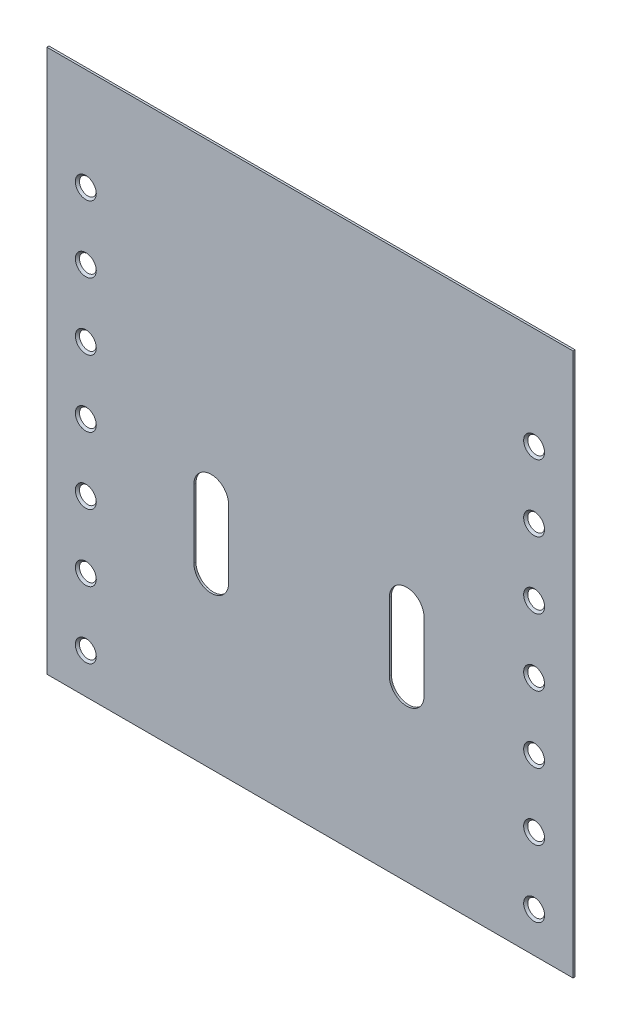
ISO-10303-21;
HEADER;
FILE_DESCRIPTION(('STEP AP214'),'2;1');
FILE_NAME('part.step','',(''),(''),'','','');
FILE_SCHEMA(('AUTOMOTIVE_DESIGN { 1 0 10303 214 1 1 1 1 }'));
ENDSEC;
DATA;
#1=APPLICATION_CONTEXT('core data for automotive mechanical design processes');
#2=APPLICATION_PROTOCOL_DEFINITION('international standard','automotive_design',2000,#1);
#3=PRODUCT_CONTEXT('',#1,'mechanical');
#4=PRODUCT('Part','Part','',(#3));
#5=PRODUCT_RELATED_PRODUCT_CATEGORY('part','',(#4));
#6=PRODUCT_DEFINITION_FORMATION('','',#4);
#7=PRODUCT_DEFINITION_CONTEXT('part definition',#1,'design');
#8=PRODUCT_DEFINITION('design','',#6,#7);
#9=PRODUCT_DEFINITION_SHAPE('','',#8);
#10=(LENGTH_UNIT() NAMED_UNIT(*) SI_UNIT(.MILLI.,.METRE.));
#11=(NAMED_UNIT(*) PLANE_ANGLE_UNIT() SI_UNIT($,.RADIAN.));
#12=(NAMED_UNIT(*) SI_UNIT($,.STERADIAN.) SOLID_ANGLE_UNIT());
#13=UNCERTAINTY_MEASURE_WITH_UNIT(LENGTH_MEASURE(1.E-05),#10,'distance_accuracy_value','');
#14=(GEOMETRIC_REPRESENTATION_CONTEXT(3) GLOBAL_UNCERTAINTY_ASSIGNED_CONTEXT((#13)) GLOBAL_UNIT_ASSIGNED_CONTEXT((#10,
#11,#12)) REPRESENTATION_CONTEXT('',''));
#15=CARTESIAN_POINT('',(0.,0.,0.));
#16=DIRECTION('',(0.,0.,1.));
#17=DIRECTION('',(1.,0.,0.));
#18=AXIS2_PLACEMENT_3D('',#15,#16,#17);
#19=CARTESIAN_POINT('',(0.,0.,-0.7747));
#20=DIRECTION('',(0.,0.,-1.));
#21=DIRECTION('',(-1.,0.,0.));
#22=AXIS2_PLACEMENT_3D('',#19,#20,#21);
#23=PLANE('',#22);
#24=CARTESIAN_POINT('',(-20.9049999994247,-222.000000003201,-0.7747));
#25=DIRECTION('',(0.,0.,-1.));
#26=DIRECTION('',(-1.,0.,0.));
#27=AXIS2_PLACEMENT_3D('',#24,#25,#26);
#28=CIRCLE('',#27,3.13730000000001);
#29=CARTESIAN_POINT('',(-24.0422999994247,-222.000000003201,-0.7747));
#30=VERTEX_POINT('',#29);
#31=EDGE_CURVE('E45',#30,#30,#28,.T.);
#32=ORIENTED_EDGE('',*,*,#31,.F.);
#33=EDGE_LOOP('',(#32));
#34=FACE_BOUND('',#33,.T.);
#35=CARTESIAN_POINT('',(-20.9049999955843,-122.00000000322,-0.7747));
#36=DIRECTION('',(0.,0.,-1.));
#37=DIRECTION('',(-1.,0.,0.));
#38=AXIS2_PLACEMENT_3D('',#35,#36,#37);
#39=CIRCLE('',#38,3.13730000000001);
#40=CARTESIAN_POINT('',(-24.0422999955843,-122.00000000322,-0.7747));
#41=VERTEX_POINT('',#40);
#42=EDGE_CURVE('E182',#41,#41,#39,.T.);
#43=ORIENTED_EDGE('',*,*,#42,.F.);
#44=EDGE_LOOP('',(#43));
#45=FACE_BOUND('',#44,.T.);
#46=CARTESIAN_POINT('',(-188.644999999999,-221.99999999998,-0.7747));
#47=DIRECTION('',(0.,0.,-1.));
#48=DIRECTION('',(-1.,0.,0.));
#49=AXIS2_PLACEMENT_3D('',#46,#47,#48);
#50=CIRCLE('',#49,3.1373);
#51=CARTESIAN_POINT('',(-191.782299999999,-221.99999999998,-0.7747));
#52=VERTEX_POINT('',#51);
#53=EDGE_CURVE('E227',#52,#52,#50,.T.);
#54=ORIENTED_EDGE('',*,*,#53,.F.);
#55=EDGE_LOOP('',(#54));
#56=FACE_BOUND('',#55,.T.);
#57=CARTESIAN_POINT('',(-188.645,-197.,-0.7747));
#58=DIRECTION('',(0.,0.,-1.));
#59=DIRECTION('',(-1.,0.,0.));
#60=AXIS2_PLACEMENT_3D('',#57,#58,#59);
#61=CIRCLE('',#60,3.1373);
#62=CARTESIAN_POINT('',(-191.7823,-197.,-0.7747));
#63=VERTEX_POINT('',#62);
#64=EDGE_CURVE('E233',#63,#63,#61,.T.);
#65=ORIENTED_EDGE('',*,*,#64,.F.);
#66=EDGE_LOOP('',(#65));
#67=FACE_BOUND('',#66,.T.);
#68=CARTESIAN_POINT('',(-188.645,-172.,-0.7747));
#69=DIRECTION('',(0.,0.,-1.));
#70=DIRECTION('',(-1.,0.,0.));
#71=AXIS2_PLACEMENT_3D('',#68,#69,#70);
#72=CIRCLE('',#71,3.1373);
#73=CARTESIAN_POINT('',(-191.7823,-172.,-0.7747));
#74=VERTEX_POINT('',#73);
#75=EDGE_CURVE('E239',#74,#74,#72,.T.);
#76=ORIENTED_EDGE('',*,*,#75,.F.);
#77=EDGE_LOOP('',(#76));
#78=FACE_BOUND('',#77,.T.);
#79=CARTESIAN_POINT('',(-188.645,-122.,-0.7747));
#80=DIRECTION('',(0.,0.,-1.));
#81=DIRECTION('',(-1.,0.,0.));
#82=AXIS2_PLACEMENT_3D('',#79,#80,#81);
#83=CIRCLE('',#82,3.1373);
#84=CARTESIAN_POINT('',(-191.7823,-122.,-0.7747));
#85=VERTEX_POINT('',#84);
#86=EDGE_CURVE('E251',#85,#85,#83,.T.);
#87=ORIENTED_EDGE('',*,*,#86,.F.);
#88=EDGE_LOOP('',(#87));
#89=FACE_BOUND('',#88,.T.);
#90=CARTESIAN_POINT('',(-188.644999999999,-71.9999999999807,-0.7747));
#91=DIRECTION('',(0.,0.,-1.));
#92=DIRECTION('',(-1.,0.,0.));
#93=AXIS2_PLACEMENT_3D('',#90,#91,#92);
#94=CIRCLE('',#93,3.1373);
#95=CARTESIAN_POINT('',(-191.782299999999,-71.9999999999807,-0.7747));
#96=VERTEX_POINT('',#95);
#97=EDGE_CURVE('E152',#96,#96,#94,.T.);
#98=ORIENTED_EDGE('',*,*,#97,.F.);
#99=EDGE_LOOP('',(#98));
#100=FACE_BOUND('',#99,.T.);
#101=DIRECTION('',(0.,1.,0.));
#102=VECTOR('',#101,1.);
#103=CARTESIAN_POINT('',(-203.2,-237.,-0.7747));
#104=LINE('',#103,#102);
#105=CARTESIAN_POINT('',(-203.2,-237.,-0.7747));
#106=VERTEX_POINT('',#105);
#107=CARTESIAN_POINT('',(-203.2,-33.7999999999999,-0.7747));
#108=VERTEX_POINT('',#107);
#109=EDGE_CURVE('E159',#106,#108,#104,.T.);
#110=ORIENTED_EDGE('',*,*,#109,.T.);
#111=DIRECTION('',(1.,0.,0.));
#112=VECTOR('',#111,1.);
#113=CARTESIAN_POINT('',(-203.2,-33.7999999999999,-0.7747));
#114=LINE('',#113,#112);
#115=CARTESIAN_POINT('',(-6.35000000000006,-33.8,-0.7747));
#116=VERTEX_POINT('',#115);
#117=EDGE_CURVE('E155',#108,#116,#114,.T.);
#118=ORIENTED_EDGE('',*,*,#117,.T.);
#119=DIRECTION('',(0.,-1.,0.));
#120=VECTOR('',#119,1.);
#121=CARTESIAN_POINT('',(-6.35000000000001,-237.,-0.7747));
#122=LINE('',#121,#120);
#123=CARTESIAN_POINT('',(-6.35000000000001,-237.,-0.7747));
#124=VERTEX_POINT('',#123);
#125=EDGE_CURVE('E158',#116,#124,#122,.T.);
#126=ORIENTED_EDGE('',*,*,#125,.T.);
#127=DIRECTION('',(-1.,0.,0.));
#128=VECTOR('',#127,1.);
#129=CARTESIAN_POINT('',(-203.2,-237.,-0.7747));
#130=LINE('',#129,#128);
#131=EDGE_CURVE('E161',#124,#106,#130,.T.);
#132=ORIENTED_EDGE('',*,*,#131,.T.);
#133=EDGE_LOOP('',(#110,#118,#126,#132));
#134=FACE_BOUND('',#133,.T.);
#135=CARTESIAN_POINT('',(-141.721253235897,-173.5,-0.774699999999979));
#136=DIRECTION('',(0.,0.,-1.));
#137=DIRECTION('',(0.,1.,0.));
#138=AXIS2_PLACEMENT_3D('',#135,#136,#137);
#139=CIRCLE('',#138,6.49999999999995);
#140=CARTESIAN_POINT('',(-135.221253235897,-173.5,-0.774699999999979));
#141=VERTEX_POINT('',#140);
#142=CARTESIAN_POINT('',(-148.221253235897,-173.5,-0.7747));
#143=VERTEX_POINT('',#142);
#144=EDGE_CURVE('E58',#141,#143,#139,.T.);
#145=ORIENTED_EDGE('',*,*,#144,.F.);
#146=DIRECTION('',(0.,-1.,0.));
#147=VECTOR('',#146,1.);
#148=CARTESIAN_POINT('',(-135.221253235897,-173.5,-0.774699999999979));
#149=LINE('',#148,#147);
#150=CARTESIAN_POINT('',(-135.221253235897,-148.,-0.774699999999982));
#151=VERTEX_POINT('',#150);
#152=EDGE_CURVE('E263',#151,#141,#149,.T.);
#153=ORIENTED_EDGE('',*,*,#152,.F.);
#154=CARTESIAN_POINT('',(-141.721253235897,-148.,-0.774699999999982));
#155=DIRECTION('',(0.,0.,-1.));
#156=DIRECTION('',(0.,1.,0.));
#157=AXIS2_PLACEMENT_3D('',#154,#155,#156);
#158=CIRCLE('',#157,6.49999999999995);
#159=CARTESIAN_POINT('',(-148.221253235897,-148.,-0.774699999999982));
#160=VERTEX_POINT('',#159);
#161=EDGE_CURVE('E278',#160,#151,#158,.T.);
#162=ORIENTED_EDGE('',*,*,#161,.F.);
#163=DIRECTION('',(0.,1.,0.));
#164=VECTOR('',#163,1.);
#165=CARTESIAN_POINT('',(-148.221253235897,-173.5,-0.774699999999979));
#166=LINE('',#165,#164);
#167=EDGE_CURVE('E274',#143,#160,#166,.T.);
#168=ORIENTED_EDGE('',*,*,#167,.F.);
#169=EDGE_LOOP('',(#145,#153,#162,#168));
#170=FACE_BOUND('',#169,.T.);
#171=CARTESIAN_POINT('',(-68.5692532358968,-173.5,-0.774699999999979));
#172=DIRECTION('',(0.,0.,-1.));
#173=DIRECTION('',(0.,1.,0.));
#174=AXIS2_PLACEMENT_3D('',#171,#172,#173);
#175=CIRCLE('',#174,6.5);
#176=CARTESIAN_POINT('',(-62.0692532358968,-173.5,-0.774699999999979));
#177=VERTEX_POINT('',#176);
#178=CARTESIAN_POINT('',(-75.0692532358968,-173.5,-0.7747));
#179=VERTEX_POINT('',#178);
#180=EDGE_CURVE('E66',#177,#179,#175,.T.);
#181=ORIENTED_EDGE('',*,*,#180,.F.);
#182=DIRECTION('',(0.,-1.,0.));
#183=VECTOR('',#182,1.);
#184=CARTESIAN_POINT('',(-62.0692532358968,-173.5,-0.774699999999979));
#185=LINE('',#184,#183);
#186=CARTESIAN_POINT('',(-62.0692532358968,-148.,-0.774699999999982));
#187=VERTEX_POINT('',#186);
#188=EDGE_CURVE('E293',#187,#177,#185,.T.);
#189=ORIENTED_EDGE('',*,*,#188,.F.);
#190=CARTESIAN_POINT('',(-68.5692532358968,-148.,-0.774699999999982));
#191=DIRECTION('',(0.,0.,-1.));
#192=DIRECTION('',(0.,1.,0.));
#193=AXIS2_PLACEMENT_3D('',#190,#191,#192);
#194=CIRCLE('',#193,6.5);
#195=CARTESIAN_POINT('',(-75.0692532358968,-148.,-0.774699999999982));
#196=VERTEX_POINT('',#195);
#197=EDGE_CURVE('E307',#196,#187,#194,.T.);
#198=ORIENTED_EDGE('',*,*,#197,.F.);
#199=DIRECTION('',(0.,1.,0.));
#200=VECTOR('',#199,1.);
#201=CARTESIAN_POINT('',(-75.0692532358968,-173.5,-0.774699999999979));
#202=LINE('',#201,#200);
#203=EDGE_CURVE('E304',#179,#196,#202,.T.);
#204=ORIENTED_EDGE('',*,*,#203,.F.);
#205=EDGE_LOOP('',(#181,#189,#198,#204));
#206=FACE_BOUND('',#205,.T.);
#207=CARTESIAN_POINT('',(-188.645,-96.9999999999999,-0.7747));
#208=DIRECTION('',(0.,0.,-1.));
#209=DIRECTION('',(-1.,0.,0.));
#210=AXIS2_PLACEMENT_3D('',#207,#208,#209);
#211=CIRCLE('',#210,3.1373);
#212=CARTESIAN_POINT('',(-191.7823,-96.9999999999999,-0.7747));
#213=VERTEX_POINT('',#212);
#214=EDGE_CURVE('E178',#213,#213,#211,.T.);
#215=ORIENTED_EDGE('',*,*,#214,.F.);
#216=EDGE_LOOP('',(#215));
#217=FACE_BOUND('',#216,.T.);
#218=CARTESIAN_POINT('',(-188.645,-147.,-0.7747));
#219=DIRECTION('',(0.,0.,-1.));
#220=DIRECTION('',(-1.,0.,0.));
#221=AXIS2_PLACEMENT_3D('',#218,#219,#220);
#222=CIRCLE('',#221,3.1373);
#223=CARTESIAN_POINT('',(-191.7823,-147.,-0.7747));
#224=VERTEX_POINT('',#223);
#225=EDGE_CURVE('E245',#224,#224,#222,.T.);
#226=ORIENTED_EDGE('',*,*,#225,.F.);
#227=EDGE_LOOP('',(#226));
#228=FACE_BOUND('',#227,.T.);
#229=CARTESIAN_POINT('',(-20.9049999936649,-72.0000000032012,-0.7747));
#230=DIRECTION('',(0.,0.,-1.));
#231=DIRECTION('',(-1.,0.,0.));
#232=AXIS2_PLACEMENT_3D('',#229,#230,#231);
#233=CIRCLE('',#232,3.13730000000001);
#234=CARTESIAN_POINT('',(-24.0422999936649,-72.0000000032012,-0.7747));
#235=VERTEX_POINT('',#234);
#236=EDGE_CURVE('E221',#235,#235,#233,.T.);
#237=ORIENTED_EDGE('',*,*,#236,.F.);
#238=EDGE_LOOP('',(#237));
#239=FACE_BOUND('',#238,.T.);
#240=CARTESIAN_POINT('',(-20.9049999946243,-97.0000000032205,-0.7747));
#241=DIRECTION('',(0.,0.,-1.));
#242=DIRECTION('',(-1.,0.,0.));
#243=AXIS2_PLACEMENT_3D('',#240,#241,#242);
#244=CIRCLE('',#243,3.13730000000001);
#245=CARTESIAN_POINT('',(-24.0422999946243,-97.0000000032205,-0.7747));
#246=VERTEX_POINT('',#245);
#247=EDGE_CURVE('E215',#246,#246,#244,.T.);
#248=ORIENTED_EDGE('',*,*,#247,.F.);
#249=EDGE_LOOP('',(#248));
#250=FACE_BOUND('',#249,.T.);
#251=CARTESIAN_POINT('',(-20.9049999965443,-147.00000000322,-0.7747));
#252=DIRECTION('',(0.,0.,-1.));
#253=DIRECTION('',(-1.,0.,0.));
#254=AXIS2_PLACEMENT_3D('',#251,#252,#253);
#255=CIRCLE('',#254,3.13730000000001);
#256=CARTESIAN_POINT('',(-24.0422999965443,-147.00000000322,-0.7747));
#257=VERTEX_POINT('',#256);
#258=EDGE_CURVE('E187',#257,#257,#255,.T.);
#259=ORIENTED_EDGE('',*,*,#258,.F.);
#260=EDGE_LOOP('',(#259));
#261=FACE_BOUND('',#260,.T.);
#262=CARTESIAN_POINT('',(-20.9049999975043,-172.00000000322,-0.7747));
#263=DIRECTION('',(0.,0.,-1.));
#264=DIRECTION('',(-1.,0.,0.));
#265=AXIS2_PLACEMENT_3D('',#262,#263,#264);
#266=CIRCLE('',#265,3.13730000000001);
#267=CARTESIAN_POINT('',(-24.0422999975043,-172.00000000322,-0.7747));
#268=VERTEX_POINT('',#267);
#269=EDGE_CURVE('E197',#268,#268,#266,.T.);
#270=ORIENTED_EDGE('',*,*,#269,.F.);
#271=EDGE_LOOP('',(#270));
#272=FACE_BOUND('',#271,.T.);
#273=CARTESIAN_POINT('',(-20.9049999984643,-197.00000000322,-0.7747));
#274=DIRECTION('',(0.,0.,-1.));
#275=DIRECTION('',(-1.,0.,0.));
#276=AXIS2_PLACEMENT_3D('',#273,#274,#275);
#277=CIRCLE('',#276,3.13730000000001);
#278=CARTESIAN_POINT('',(-24.0422999984643,-197.00000000322,-0.7747));
#279=VERTEX_POINT('',#278);
#280=EDGE_CURVE('E190',#279,#279,#277,.T.);
#281=ORIENTED_EDGE('',*,*,#280,.F.);
#282=EDGE_LOOP('',(#281));
#283=FACE_BOUND('',#282,.T.);
#284=ADVANCED_FACE('F41',(#34,#45,#56,#67,#78,#89,#100,#134,#170,#206,#217,#228,#239,#250,#261,
#272,#283),#23,.T.);
#285=CARTESIAN_POINT('',(0.,0.,0.));
#286=DIRECTION('',(0.,0.,-1.));
#287=DIRECTION('',(-1.,0.,0.));
#288=AXIS2_PLACEMENT_3D('',#285,#286,#287);
#289=PLANE('',#288);
#290=CARTESIAN_POINT('',(-20.9049999994247,-222.000000003201,0.));
#291=DIRECTION('',(0.,0.,1.));
#292=DIRECTION('',(0.,-1.,0.));
#293=AXIS2_PLACEMENT_3D('',#290,#291,#292);
#294=CIRCLE('',#293,3.912);
#295=CARTESIAN_POINT('',(-20.9049999994247,-225.912000003201,0.));
#296=VERTEX_POINT('',#295);
#297=EDGE_CURVE('E204',#296,#296,#294,.T.);
#298=ORIENTED_EDGE('',*,*,#297,.F.);
#299=EDGE_LOOP('',(#298));
#300=FACE_BOUND('',#299,.T.);
#301=CARTESIAN_POINT('',(-20.9049999965443,-147.00000000322,0.));
#302=DIRECTION('',(0.,0.,1.));
#303=DIRECTION('',(0.,-1.,0.));
#304=AXIS2_PLACEMENT_3D('',#301,#302,#303);
#305=CIRCLE('',#304,3.912);
#306=CARTESIAN_POINT('',(-20.9049999965443,-150.91200000322,0.));
#307=VERTEX_POINT('',#306);
#308=EDGE_CURVE('E189',#307,#307,#305,.T.);
#309=ORIENTED_EDGE('',*,*,#308,.F.);
#310=EDGE_LOOP('',(#309));
#311=FACE_BOUND('',#310,.T.);
#312=CARTESIAN_POINT('',(-188.644999999999,-221.99999999998,0.));
#313=DIRECTION('',(0.,0.,1.));
#314=DIRECTION('',(1.,0.,0.));
#315=AXIS2_PLACEMENT_3D('',#312,#313,#314);
#316=CIRCLE('',#315,3.912);
#317=CARTESIAN_POINT('',(-184.732999999999,-221.99999999998,0.));
#318=VERTEX_POINT('',#317);
#319=EDGE_CURVE('E224',#318,#318,#316,.T.);
#320=ORIENTED_EDGE('',*,*,#319,.F.);
#321=EDGE_LOOP('',(#320));
#322=FACE_BOUND('',#321,.T.);
#323=CARTESIAN_POINT('',(-188.645,-197.,0.));
#324=DIRECTION('',(0.,0.,1.));
#325=DIRECTION('',(1.,0.,0.));
#326=AXIS2_PLACEMENT_3D('',#323,#324,#325);
#327=CIRCLE('',#326,3.912);
#328=CARTESIAN_POINT('',(-184.733,-197.,0.));
#329=VERTEX_POINT('',#328);
#330=EDGE_CURVE('E230',#329,#329,#327,.T.);
#331=ORIENTED_EDGE('',*,*,#330,.F.);
#332=EDGE_LOOP('',(#331));
#333=FACE_BOUND('',#332,.T.);
#334=CARTESIAN_POINT('',(-188.645,-172.,0.));
#335=DIRECTION('',(0.,0.,1.));
#336=DIRECTION('',(1.,0.,0.));
#337=AXIS2_PLACEMENT_3D('',#334,#335,#336);
#338=CIRCLE('',#337,3.912);
#339=CARTESIAN_POINT('',(-184.733,-172.,0.));
#340=VERTEX_POINT('',#339);
#341=EDGE_CURVE('E236',#340,#340,#338,.T.);
#342=ORIENTED_EDGE('',*,*,#341,.F.);
#343=EDGE_LOOP('',(#342));
#344=FACE_BOUND('',#343,.T.);
#345=CARTESIAN_POINT('',(-188.645,-147.,0.));
#346=DIRECTION('',(0.,0.,1.));
#347=DIRECTION('',(1.,0.,0.));
#348=AXIS2_PLACEMENT_3D('',#345,#346,#347);
#349=CIRCLE('',#348,3.912);
#350=CARTESIAN_POINT('',(-184.733,-147.,0.));
#351=VERTEX_POINT('',#350);
#352=EDGE_CURVE('E242',#351,#351,#349,.T.);
#353=ORIENTED_EDGE('',*,*,#352,.F.);
#354=EDGE_LOOP('',(#353));
#355=FACE_BOUND('',#354,.T.);
#356=CARTESIAN_POINT('',(-188.645,-122.,0.));
#357=DIRECTION('',(0.,0.,1.));
#358=DIRECTION('',(1.,0.,0.));
#359=AXIS2_PLACEMENT_3D('',#356,#357,#358);
#360=CIRCLE('',#359,3.912);
#361=CARTESIAN_POINT('',(-184.733,-122.,0.));
#362=VERTEX_POINT('',#361);
#363=EDGE_CURVE('E248',#362,#362,#360,.T.);
#364=ORIENTED_EDGE('',*,*,#363,.F.);
#365=EDGE_LOOP('',(#364));
#366=FACE_BOUND('',#365,.T.);
#367=CARTESIAN_POINT('',(-188.645,-96.9999999999999,0.));
#368=DIRECTION('',(0.,0.,1.));
#369=DIRECTION('',(1.,0.,0.));
#370=AXIS2_PLACEMENT_3D('',#367,#368,#369);
#371=CIRCLE('',#370,3.912);
#372=CARTESIAN_POINT('',(-184.733,-96.9999999999999,0.));
#373=VERTEX_POINT('',#372);
#374=EDGE_CURVE('E181',#373,#373,#371,.T.);
#375=ORIENTED_EDGE('',*,*,#374,.F.);
#376=EDGE_LOOP('',(#375));
#377=FACE_BOUND('',#376,.T.);
#378=CARTESIAN_POINT('',(-188.644999999999,-71.9999999999807,0.));
#379=DIRECTION('',(0.,0.,1.));
#380=DIRECTION('',(1.,0.,0.));
#381=AXIS2_PLACEMENT_3D('',#378,#379,#380);
#382=CIRCLE('',#381,3.912);
#383=CARTESIAN_POINT('',(-184.732999999999,-71.9999999999807,0.));
#384=VERTEX_POINT('',#383);
#385=EDGE_CURVE('E177',#384,#384,#382,.T.);
#386=ORIENTED_EDGE('',*,*,#385,.F.);
#387=EDGE_LOOP('',(#386));
#388=FACE_BOUND('',#387,.T.);
#389=DIRECTION('',(0.,-1.,0.));
#390=VECTOR('',#389,1.);
#391=CARTESIAN_POINT('',(-62.0692532358968,-173.5,0.));
#392=LINE('',#391,#390);
#393=CARTESIAN_POINT('',(-62.0692532358968,-148.,0.));
#394=VERTEX_POINT('',#393);
#395=CARTESIAN_POINT('',(-62.0692532358968,-173.5,0.));
#396=VERTEX_POINT('',#395);
#397=EDGE_CURVE('E299',#394,#396,#392,.T.);
#398=ORIENTED_EDGE('',*,*,#397,.T.);
#399=CARTESIAN_POINT('',(-68.5692532358968,-173.5,0.));
#400=DIRECTION('',(0.,0.,-1.));
#401=DIRECTION('',(0.,1.,0.));
#402=AXIS2_PLACEMENT_3D('',#399,#400,#401);
#403=CIRCLE('',#402,6.5);
#404=CARTESIAN_POINT('',(-75.0692532358968,-173.5,0.));
#405=VERTEX_POINT('',#404);
#406=EDGE_CURVE('E289',#396,#405,#403,.T.);
#407=ORIENTED_EDGE('',*,*,#406,.T.);
#408=DIRECTION('',(0.,1.,0.));
#409=VECTOR('',#408,1.);
#410=CARTESIAN_POINT('',(-75.0692532358968,-173.5,0.));
#411=LINE('',#410,#409);
#412=CARTESIAN_POINT('',(-75.0692532358968,-148.,0.));
#413=VERTEX_POINT('',#412);
#414=EDGE_CURVE('E292',#405,#413,#411,.T.);
#415=ORIENTED_EDGE('',*,*,#414,.T.);
#416=CARTESIAN_POINT('',(-68.5692532358968,-148.,0.));
#417=DIRECTION('',(0.,0.,-1.));
#418=DIRECTION('',(0.,1.,0.));
#419=AXIS2_PLACEMENT_3D('',#416,#417,#418);
#420=CIRCLE('',#419,6.5);
#421=EDGE_CURVE('E296',#413,#394,#420,.T.);
#422=ORIENTED_EDGE('',*,*,#421,.T.);
#423=EDGE_LOOP('',(#398,#407,#415,#422));
#424=FACE_BOUND('',#423,.T.);
#425=DIRECTION('',(0.,-1.,0.));
#426=VECTOR('',#425,1.);
#427=CARTESIAN_POINT('',(-135.221253235897,-173.5,0.));
#428=LINE('',#427,#426);
#429=CARTESIAN_POINT('',(-135.221253235897,-148.,0.));
#430=VERTEX_POINT('',#429);
#431=CARTESIAN_POINT('',(-135.221253235897,-173.5,0.));
#432=VERTEX_POINT('',#431);
#433=EDGE_CURVE('E269',#430,#432,#428,.T.);
#434=ORIENTED_EDGE('',*,*,#433,.T.);
#435=CARTESIAN_POINT('',(-141.721253235897,-173.5,0.));
#436=DIRECTION('',(0.,0.,-1.));
#437=DIRECTION('',(0.,1.,0.));
#438=AXIS2_PLACEMENT_3D('',#435,#436,#437);
#439=CIRCLE('',#438,6.49999999999995);
#440=CARTESIAN_POINT('',(-148.221253235897,-173.5,0.));
#441=VERTEX_POINT('',#440);
#442=EDGE_CURVE('E259',#432,#441,#439,.T.);
#443=ORIENTED_EDGE('',*,*,#442,.T.);
#444=DIRECTION('',(0.,1.,0.));
#445=VECTOR('',#444,1.);
#446=CARTESIAN_POINT('',(-148.221253235897,-173.5,0.));
#447=LINE('',#446,#445);
#448=CARTESIAN_POINT('',(-148.221253235897,-148.,0.));
#449=VERTEX_POINT('',#448);
#450=EDGE_CURVE('E262',#441,#449,#447,.T.);
#451=ORIENTED_EDGE('',*,*,#450,.T.);
#452=CARTESIAN_POINT('',(-141.721253235897,-148.,0.));
#453=DIRECTION('',(0.,0.,-1.));
#454=DIRECTION('',(0.,1.,0.));
#455=AXIS2_PLACEMENT_3D('',#452,#453,#454);
#456=CIRCLE('',#455,6.49999999999995);
#457=EDGE_CURVE('E266',#449,#430,#456,.T.);
#458=ORIENTED_EDGE('',*,*,#457,.T.);
#459=EDGE_LOOP('',(#434,#443,#451,#458));
#460=FACE_BOUND('',#459,.T.);
#461=DIRECTION('',(-1.,0.,0.));
#462=VECTOR('',#461,1.);
#463=CARTESIAN_POINT('',(-203.2,-237.,0.));
#464=LINE('',#463,#462);
#465=CARTESIAN_POINT('',(-6.35000000000001,-237.,0.));
#466=VERTEX_POINT('',#465);
#467=CARTESIAN_POINT('',(-203.2,-237.,0.));
#468=VERTEX_POINT('',#467);
#469=EDGE_CURVE('E163',#466,#468,#464,.T.);
#470=ORIENTED_EDGE('',*,*,#469,.F.);
#471=DIRECTION('',(0.,-1.,0.));
#472=VECTOR('',#471,1.);
#473=CARTESIAN_POINT('',(-6.35000000000001,-237.,0.));
#474=LINE('',#473,#472);
#475=CARTESIAN_POINT('',(-6.35000000000006,-33.7999999999999,0.));
#476=VERTEX_POINT('',#475);
#477=EDGE_CURVE('E141',#476,#466,#474,.T.);
#478=ORIENTED_EDGE('',*,*,#477,.F.);
#479=DIRECTION('',(-1.,0.,0.));
#480=VECTOR('',#479,1.);
#481=CARTESIAN_POINT('',(-6.35000000000006,-33.7999999999999,0.));
#482=LINE('',#481,#480);
#483=CARTESIAN_POINT('',(-203.2,-33.8,0.));
#484=VERTEX_POINT('',#483);
#485=EDGE_CURVE('E145',#476,#484,#482,.T.);
#486=ORIENTED_EDGE('',*,*,#485,.T.);
#487=DIRECTION('',(0.,1.,0.));
#488=VECTOR('',#487,1.);
#489=CARTESIAN_POINT('',(-203.2,-237.,0.));
#490=LINE('',#489,#488);
#491=EDGE_CURVE('E133',#468,#484,#490,.T.);
#492=ORIENTED_EDGE('',*,*,#491,.F.);
#493=EDGE_LOOP('',(#470,#478,#486,#492));
#494=FACE_BOUND('',#493,.T.);
#495=CARTESIAN_POINT('',(-20.9049999936649,-72.0000000032012,0.));
#496=DIRECTION('',(0.,0.,1.));
#497=DIRECTION('',(0.,-1.,0.));
#498=AXIS2_PLACEMENT_3D('',#495,#496,#497);
#499=CIRCLE('',#498,3.912);
#500=CARTESIAN_POINT('',(-20.9049999936649,-75.9120000032012,0.));
#501=VERTEX_POINT('',#500);
#502=EDGE_CURVE('E218',#501,#501,#499,.T.);
#503=ORIENTED_EDGE('',*,*,#502,.F.);
#504=EDGE_LOOP('',(#503));
#505=FACE_BOUND('',#504,.T.);
#506=CARTESIAN_POINT('',(-20.9049999946243,-97.0000000032205,0.));
#507=DIRECTION('',(0.,0.,1.));
#508=DIRECTION('',(0.,-1.,0.));
#509=AXIS2_PLACEMENT_3D('',#506,#507,#508);
#510=CIRCLE('',#509,3.912);
#511=CARTESIAN_POINT('',(-20.9049999946243,-100.91200000322,0.));
#512=VERTEX_POINT('',#511);
#513=EDGE_CURVE('E185',#512,#512,#510,.T.);
#514=ORIENTED_EDGE('',*,*,#513,.F.);
#515=EDGE_LOOP('',(#514));
#516=FACE_BOUND('',#515,.T.);
#517=CARTESIAN_POINT('',(-20.9049999955843,-122.00000000322,0.));
#518=DIRECTION('',(0.,0.,1.));
#519=DIRECTION('',(0.,-1.,0.));
#520=AXIS2_PLACEMENT_3D('',#517,#518,#519);
#521=CIRCLE('',#520,3.912);
#522=CARTESIAN_POINT('',(-20.9049999955843,-125.91200000322,0.));
#523=VERTEX_POINT('',#522);
#524=EDGE_CURVE('E186',#523,#523,#521,.T.);
#525=ORIENTED_EDGE('',*,*,#524,.F.);
#526=EDGE_LOOP('',(#525));
#527=FACE_BOUND('',#526,.T.);
#528=CARTESIAN_POINT('',(-20.9049999975043,-172.00000000322,0.));
#529=DIRECTION('',(0.,0.,1.));
#530=DIRECTION('',(0.,-1.,0.));
#531=AXIS2_PLACEMENT_3D('',#528,#529,#530);
#532=CIRCLE('',#531,3.912);
#533=CARTESIAN_POINT('',(-20.9049999975043,-175.91200000322,0.));
#534=VERTEX_POINT('',#533);
#535=EDGE_CURVE('E192',#534,#534,#532,.T.);
#536=ORIENTED_EDGE('',*,*,#535,.F.);
#537=EDGE_LOOP('',(#536));
#538=FACE_BOUND('',#537,.T.);
#539=CARTESIAN_POINT('',(-20.9049999984643,-197.00000000322,0.));
#540=DIRECTION('',(0.,0.,1.));
#541=DIRECTION('',(0.,-1.,0.));
#542=AXIS2_PLACEMENT_3D('',#539,#540,#541);
#543=CIRCLE('',#542,3.912);
#544=CARTESIAN_POINT('',(-20.9049999984643,-200.91200000322,0.));
#545=VERTEX_POINT('',#544);
#546=EDGE_CURVE('E193',#545,#545,#543,.T.);
#547=ORIENTED_EDGE('',*,*,#546,.F.);
#548=EDGE_LOOP('',(#547));
#549=FACE_BOUND('',#548,.T.);
#550=ADVANCED_FACE('F146',(#300,#311,#322,#333,#344,#355,#366,#377,#388,#424,#460,#494,#505,
#516,#527,#538,#549),#289,.F.);
#551=CARTESIAN_POINT('',(-203.2,-237.,-0.7747));
#552=DIRECTION('',(1.,0.,0.));
#553=DIRECTION('',(0.,1.,0.));
#554=AXIS2_PLACEMENT_3D('',#551,#552,#553);
#555=PLANE('',#554);
#556=ORIENTED_EDGE('',*,*,#491,.T.);
#557=DIRECTION('',(0.,0.,1.));
#558=VECTOR('',#557,1.);
#559=CARTESIAN_POINT('',(-203.2,-33.7999999999999,-0.7747));
#560=LINE('',#559,#558);
#561=EDGE_CURVE('E12',#108,#484,#560,.T.);
#562=ORIENTED_EDGE('',*,*,#561,.F.);
#563=ORIENTED_EDGE('',*,*,#109,.F.);
#564=DIRECTION('',(0.,0.,1.));
#565=VECTOR('',#564,1.);
#566=CARTESIAN_POINT('',(-203.2,-237.,-0.7747));
#567=LINE('',#566,#565);
#568=EDGE_CURVE('E137',#106,#468,#567,.T.);
#569=ORIENTED_EDGE('',*,*,#568,.T.);
#570=EDGE_LOOP('',(#556,#562,#563,#569));
#571=FACE_BOUND('',#570,.T.);
#572=ADVANCED_FACE('F43',(#571),#555,.F.);
#573=CARTESIAN_POINT('',(-203.2,-33.7999999999999,-0.7747));
#574=DIRECTION('',(0.,-1.,0.));
#575=DIRECTION('',(1.,0.,0.));
#576=AXIS2_PLACEMENT_3D('',#573,#574,#575);
#577=PLANE('',#576);
#578=ORIENTED_EDGE('',*,*,#561,.T.);
#579=ORIENTED_EDGE('',*,*,#485,.F.);
#580=DIRECTION('',(0.,0.,1.));
#581=VECTOR('',#580,1.);
#582=CARTESIAN_POINT('',(-6.35000000000006,-33.8,-0.7747));
#583=LINE('',#582,#581);
#584=EDGE_CURVE('E50',#116,#476,#583,.T.);
#585=ORIENTED_EDGE('',*,*,#584,.F.);
#586=ORIENTED_EDGE('',*,*,#117,.F.);
#587=EDGE_LOOP('',(#578,#579,#585,#586));
#588=FACE_BOUND('',#587,.T.);
#589=ADVANCED_FACE('F154',(#588),#577,.F.);
#590=CARTESIAN_POINT('',(-6.35000000000001,-237.,-0.7747));
#591=DIRECTION('',(-1.,0.,0.));
#592=DIRECTION('',(0.,-1.,0.));
#593=AXIS2_PLACEMENT_3D('',#590,#591,#592);
#594=PLANE('',#593);
#595=ORIENTED_EDGE('',*,*,#584,.T.);
#596=ORIENTED_EDGE('',*,*,#477,.T.);
#597=DIRECTION('',(0.,0.,1.));
#598=VECTOR('',#597,1.);
#599=CARTESIAN_POINT('',(-6.35000000000001,-237.,-0.7747));
#600=LINE('',#599,#598);
#601=EDGE_CURVE('E171',#124,#466,#600,.T.);
#602=ORIENTED_EDGE('',*,*,#601,.F.);
#603=ORIENTED_EDGE('',*,*,#125,.F.);
#604=EDGE_LOOP('',(#595,#596,#602,#603));
#605=FACE_BOUND('',#604,.T.);
#606=ADVANCED_FACE('F358',(#605),#594,.F.);
#607=CARTESIAN_POINT('',(-203.2,-237.,-0.7747));
#608=DIRECTION('',(0.,1.,0.));
#609=DIRECTION('',(0.,0.,1.));
#610=AXIS2_PLACEMENT_3D('',#607,#608,#609);
#611=PLANE('',#610);
#612=ORIENTED_EDGE('',*,*,#469,.T.);
#613=ORIENTED_EDGE('',*,*,#568,.F.);
#614=ORIENTED_EDGE('',*,*,#131,.F.);
#615=ORIENTED_EDGE('',*,*,#601,.T.);
#616=EDGE_LOOP('',(#612,#613,#614,#615));
#617=FACE_BOUND('',#616,.T.);
#618=ADVANCED_FACE('F341',(#617),#611,.F.);
#619=CARTESIAN_POINT('',(-68.5692532358968,-173.5,0.));
#620=DIRECTION('',(0.,0.,-1.));
#621=DIRECTION('',(0.,1.,0.));
#622=AXIS2_PLACEMENT_3D('',#619,#620,#621);
#623=CYLINDRICAL_SURFACE('',#622,6.5);
#624=ORIENTED_EDGE('',*,*,#180,.T.);
#625=DIRECTION('',(0.,0.,-1.));
#626=VECTOR('',#625,1.);
#627=CARTESIAN_POINT('',(-75.0692532358968,-173.5,0.));
#628=LINE('',#627,#626);
#629=EDGE_CURVE('E302',#405,#179,#628,.T.);
#630=ORIENTED_EDGE('',*,*,#629,.F.);
#631=ORIENTED_EDGE('',*,*,#406,.F.);
#632=DIRECTION('',(0.,0.,-1.));
#633=VECTOR('',#632,1.);
#634=CARTESIAN_POINT('',(-62.0692532358968,-173.5,0.));
#635=LINE('',#634,#633);
#636=EDGE_CURVE('E275',#396,#177,#635,.T.);
#637=ORIENTED_EDGE('',*,*,#636,.T.);
#638=EDGE_LOOP('',(#624,#630,#631,#637));
#639=FACE_BOUND('',#638,.T.);
#640=ADVANCED_FACE('F331',(#639),#623,.F.);
#641=CARTESIAN_POINT('',(-62.0692532358968,-173.5,0.));
#642=DIRECTION('',(1.,0.,0.));
#643=DIRECTION('',(0.,1.,0.));
#644=AXIS2_PLACEMENT_3D('',#641,#642,#643);
#645=PLANE('',#644);
#646=ORIENTED_EDGE('',*,*,#188,.T.);
#647=ORIENTED_EDGE('',*,*,#636,.F.);
#648=ORIENTED_EDGE('',*,*,#397,.F.);
#649=DIRECTION('',(0.,0.,-1.));
#650=VECTOR('',#649,1.);
#651=CARTESIAN_POINT('',(-62.0692532358968,-148.,0.));
#652=LINE('',#651,#650);
#653=EDGE_CURVE('E313',#394,#187,#652,.T.);
#654=ORIENTED_EDGE('',*,*,#653,.T.);
#655=EDGE_LOOP('',(#646,#647,#648,#654));
#656=FACE_BOUND('',#655,.T.);
#657=ADVANCED_FACE('F333',(#656),#645,.F.);
#658=CARTESIAN_POINT('',(-68.5692532358968,-148.,0.));
#659=DIRECTION('',(0.,0.,-1.));
#660=DIRECTION('',(0.,1.,0.));
#661=AXIS2_PLACEMENT_3D('',#658,#659,#660);
#662=CYLINDRICAL_SURFACE('',#661,6.5);
#663=ORIENTED_EDGE('',*,*,#197,.T.);
#664=ORIENTED_EDGE('',*,*,#653,.F.);
#665=ORIENTED_EDGE('',*,*,#421,.F.);
#666=DIRECTION('',(0.,0.,-1.));
#667=VECTOR('',#666,1.);
#668=CARTESIAN_POINT('',(-75.0692532358968,-148.,0.));
#669=LINE('',#668,#667);
#670=EDGE_CURVE('E315',#413,#196,#669,.T.);
#671=ORIENTED_EDGE('',*,*,#670,.T.);
#672=EDGE_LOOP('',(#663,#664,#665,#671));
#673=FACE_BOUND('',#672,.T.);
#674=ADVANCED_FACE('F327',(#673),#662,.F.);
#675=CARTESIAN_POINT('',(-75.0692532358968,-173.5,0.));
#676=DIRECTION('',(-1.,0.,0.));
#677=DIRECTION('',(0.,-1.,0.));
#678=AXIS2_PLACEMENT_3D('',#675,#676,#677);
#679=PLANE('',#678);
#680=ORIENTED_EDGE('',*,*,#203,.T.);
#681=ORIENTED_EDGE('',*,*,#670,.F.);
#682=ORIENTED_EDGE('',*,*,#414,.F.);
#683=ORIENTED_EDGE('',*,*,#629,.T.);
#684=EDGE_LOOP('',(#680,#681,#682,#683));
#685=FACE_BOUND('',#684,.T.);
#686=ADVANCED_FACE('F319',(#685),#679,.F.);
#687=CARTESIAN_POINT('',(-141.721253235897,-173.5,0.));
#688=DIRECTION('',(0.,0.,-1.));
#689=DIRECTION('',(0.,1.,0.));
#690=AXIS2_PLACEMENT_3D('',#687,#688,#689);
#691=CYLINDRICAL_SURFACE('',#690,6.49999999999995);
#692=ORIENTED_EDGE('',*,*,#144,.T.);
#693=DIRECTION('',(0.,0.,-1.));
#694=VECTOR('',#693,1.);
#695=CARTESIAN_POINT('',(-148.221253235897,-173.5,0.));
#696=LINE('',#695,#694);
#697=EDGE_CURVE('E272',#441,#143,#696,.T.);
#698=ORIENTED_EDGE('',*,*,#697,.F.);
#699=ORIENTED_EDGE('',*,*,#442,.F.);
#700=DIRECTION('',(0.,0.,-1.));
#701=VECTOR('',#700,1.);
#702=CARTESIAN_POINT('',(-135.221253235897,-173.5,0.));
#703=LINE('',#702,#701);
#704=EDGE_CURVE('E142',#432,#141,#703,.T.);
#705=ORIENTED_EDGE('',*,*,#704,.T.);
#706=EDGE_LOOP('',(#692,#698,#699,#705));
#707=FACE_BOUND('',#706,.T.);
#708=ADVANCED_FACE('F486',(#707),#691,.F.);
#709=CARTESIAN_POINT('',(-135.221253235897,-173.5,0.));
#710=DIRECTION('',(1.,0.,0.));
#711=DIRECTION('',(0.,0.,-1.));
#712=AXIS2_PLACEMENT_3D('',#709,#710,#711);
#713=PLANE('',#712);
#714=ORIENTED_EDGE('',*,*,#152,.T.);
#715=ORIENTED_EDGE('',*,*,#704,.F.);
#716=ORIENTED_EDGE('',*,*,#433,.F.);
#717=DIRECTION('',(0.,0.,-1.));
#718=VECTOR('',#717,1.);
#719=CARTESIAN_POINT('',(-135.221253235897,-148.,0.));
#720=LINE('',#719,#718);
#721=EDGE_CURVE('E284',#430,#151,#720,.T.);
#722=ORIENTED_EDGE('',*,*,#721,.T.);
#723=EDGE_LOOP('',(#714,#715,#716,#722));
#724=FACE_BOUND('',#723,.T.);
#725=ADVANCED_FACE('F482',(#724),#713,.F.);
#726=CARTESIAN_POINT('',(-141.721253235897,-148.,0.));
#727=DIRECTION('',(0.,0.,-1.));
#728=DIRECTION('',(0.,1.,0.));
#729=AXIS2_PLACEMENT_3D('',#726,#727,#728);
#730=CYLINDRICAL_SURFACE('',#729,6.49999999999995);
#731=ORIENTED_EDGE('',*,*,#161,.T.);
#732=ORIENTED_EDGE('',*,*,#721,.F.);
#733=ORIENTED_EDGE('',*,*,#457,.F.);
#734=DIRECTION('',(0.,0.,-1.));
#735=VECTOR('',#734,1.);
#736=CARTESIAN_POINT('',(-148.221253235897,-148.,0.));
#737=LINE('',#736,#735);
#738=EDGE_CURVE('E286',#449,#160,#737,.T.);
#739=ORIENTED_EDGE('',*,*,#738,.T.);
#740=EDGE_LOOP('',(#731,#732,#733,#739));
#741=FACE_BOUND('',#740,.T.);
#742=ADVANCED_FACE('F485',(#741),#730,.F.);
#743=CARTESIAN_POINT('',(-148.221253235897,-173.5,0.));
#744=DIRECTION('',(-1.,0.,0.));
#745=DIRECTION('',(0.,0.,1.));
#746=AXIS2_PLACEMENT_3D('',#743,#744,#745);
#747=PLANE('',#746);
#748=ORIENTED_EDGE('',*,*,#167,.T.);
#749=ORIENTED_EDGE('',*,*,#738,.F.);
#750=ORIENTED_EDGE('',*,*,#450,.F.);
#751=ORIENTED_EDGE('',*,*,#697,.T.);
#752=EDGE_LOOP('',(#748,#749,#750,#751));
#753=FACE_BOUND('',#752,.T.);
#754=ADVANCED_FACE('F480',(#753),#747,.F.);
#755=CARTESIAN_POINT('',(-188.644999999999,-71.9999999999807,0.));
#756=DIRECTION('',(0.,0.,1.));
#757=DIRECTION('',(1.,0.,0.));
#758=AXIS2_PLACEMENT_3D('',#755,#756,#757);
#759=CONICAL_SURFACE('',#758,3.912,0.785398163397447);
#760=ORIENTED_EDGE('',*,*,#97,.T.);
#761=EDGE_LOOP('',(#760));
#762=FACE_BOUND('',#761,.T.);
#763=ORIENTED_EDGE('',*,*,#385,.T.);
#764=EDGE_LOOP('',(#763));
#765=FACE_BOUND('',#764,.T.);
#766=ADVANCED_FACE('F476',(#762,#765),#759,.F.);
#767=CARTESIAN_POINT('',(-188.645,-96.9999999999999,0.));
#768=DIRECTION('',(0.,0.,1.));
#769=DIRECTION('',(1.,0.,0.));
#770=AXIS2_PLACEMENT_3D('',#767,#768,#769);
#771=CONICAL_SURFACE('',#770,3.912,0.785398163397447);
#772=ORIENTED_EDGE('',*,*,#214,.T.);
#773=EDGE_LOOP('',(#772));
#774=FACE_BOUND('',#773,.T.);
#775=ORIENTED_EDGE('',*,*,#374,.T.);
#776=EDGE_LOOP('',(#775));
#777=FACE_BOUND('',#776,.T.);
#778=ADVANCED_FACE('F472',(#774,#777),#771,.F.);
#779=CARTESIAN_POINT('',(-188.645,-122.,0.));
#780=DIRECTION('',(0.,0.,1.));
#781=DIRECTION('',(1.,0.,0.));
#782=AXIS2_PLACEMENT_3D('',#779,#780,#781);
#783=CONICAL_SURFACE('',#782,3.912,0.785398163397447);
#784=ORIENTED_EDGE('',*,*,#86,.T.);
#785=EDGE_LOOP('',(#784));
#786=FACE_BOUND('',#785,.T.);
#787=ORIENTED_EDGE('',*,*,#363,.T.);
#788=EDGE_LOOP('',(#787));
#789=FACE_BOUND('',#788,.T.);
#790=ADVANCED_FACE('F468',(#786,#789),#783,.F.);
#791=CARTESIAN_POINT('',(-188.645,-147.,0.));
#792=DIRECTION('',(0.,0.,1.));
#793=DIRECTION('',(1.,0.,0.));
#794=AXIS2_PLACEMENT_3D('',#791,#792,#793);
#795=CONICAL_SURFACE('',#794,3.912,0.785398163397447);
#796=ORIENTED_EDGE('',*,*,#225,.T.);
#797=EDGE_LOOP('',(#796));
#798=FACE_BOUND('',#797,.T.);
#799=ORIENTED_EDGE('',*,*,#352,.T.);
#800=EDGE_LOOP('',(#799));
#801=FACE_BOUND('',#800,.T.);
#802=ADVANCED_FACE('F464',(#798,#801),#795,.F.);
#803=CARTESIAN_POINT('',(-188.645,-172.,0.));
#804=DIRECTION('',(0.,0.,1.));
#805=DIRECTION('',(1.,0.,0.));
#806=AXIS2_PLACEMENT_3D('',#803,#804,#805);
#807=CONICAL_SURFACE('',#806,3.912,0.785398163397447);
#808=ORIENTED_EDGE('',*,*,#75,.T.);
#809=EDGE_LOOP('',(#808));
#810=FACE_BOUND('',#809,.T.);
#811=ORIENTED_EDGE('',*,*,#341,.T.);
#812=EDGE_LOOP('',(#811));
#813=FACE_BOUND('',#812,.T.);
#814=ADVANCED_FACE('F460',(#810,#813),#807,.F.);
#815=CARTESIAN_POINT('',(-188.645,-197.,0.));
#816=DIRECTION('',(0.,0.,1.));
#817=DIRECTION('',(1.,0.,0.));
#818=AXIS2_PLACEMENT_3D('',#815,#816,#817);
#819=CONICAL_SURFACE('',#818,3.912,0.785398163397447);
#820=ORIENTED_EDGE('',*,*,#64,.T.);
#821=EDGE_LOOP('',(#820));
#822=FACE_BOUND('',#821,.T.);
#823=ORIENTED_EDGE('',*,*,#330,.T.);
#824=EDGE_LOOP('',(#823));
#825=FACE_BOUND('',#824,.T.);
#826=ADVANCED_FACE('F456',(#822,#825),#819,.F.);
#827=CARTESIAN_POINT('',(-188.644999999999,-221.99999999998,0.));
#828=DIRECTION('',(0.,0.,1.));
#829=DIRECTION('',(1.,0.,0.));
#830=AXIS2_PLACEMENT_3D('',#827,#828,#829);
#831=CONICAL_SURFACE('',#830,3.912,0.785398163397447);
#832=ORIENTED_EDGE('',*,*,#53,.T.);
#833=EDGE_LOOP('',(#832));
#834=FACE_BOUND('',#833,.T.);
#835=ORIENTED_EDGE('',*,*,#319,.T.);
#836=EDGE_LOOP('',(#835));
#837=FACE_BOUND('',#836,.T.);
#838=ADVANCED_FACE('F389',(#834,#837),#831,.F.);
#839=CARTESIAN_POINT('',(-20.9049999936649,-72.0000000032012,0.));
#840=DIRECTION('',(0.,0.,1.));
#841=DIRECTION('',(0.,-1.,0.));
#842=AXIS2_PLACEMENT_3D('',#839,#840,#841);
#843=CONICAL_SURFACE('',#842,3.912,0.785398163397448);
#844=ORIENTED_EDGE('',*,*,#236,.T.);
#845=EDGE_LOOP('',(#844));
#846=FACE_BOUND('',#845,.T.);
#847=ORIENTED_EDGE('',*,*,#502,.T.);
#848=EDGE_LOOP('',(#847));
#849=FACE_BOUND('',#848,.T.);
#850=ADVANCED_FACE('F383',(#846,#849),#843,.F.);
#851=CARTESIAN_POINT('',(-20.9049999946243,-97.0000000032205,0.));
#852=DIRECTION('',(0.,0.,1.));
#853=DIRECTION('',(0.,-1.,0.));
#854=AXIS2_PLACEMENT_3D('',#851,#852,#853);
#855=CONICAL_SURFACE('',#854,3.912,0.785398163397448);
#856=ORIENTED_EDGE('',*,*,#247,.T.);
#857=EDGE_LOOP('',(#856));
#858=FACE_BOUND('',#857,.T.);
#859=ORIENTED_EDGE('',*,*,#513,.T.);
#860=EDGE_LOOP('',(#859));
#861=FACE_BOUND('',#860,.T.);
#862=ADVANCED_FACE('F388',(#858,#861),#855,.F.);
#863=CARTESIAN_POINT('',(-20.9049999955843,-122.00000000322,0.));
#864=DIRECTION('',(0.,0.,1.));
#865=DIRECTION('',(0.,-1.,0.));
#866=AXIS2_PLACEMENT_3D('',#863,#864,#865);
#867=CONICAL_SURFACE('',#866,3.912,0.785398163397448);
#868=ORIENTED_EDGE('',*,*,#42,.T.);
#869=EDGE_LOOP('',(#868));
#870=FACE_BOUND('',#869,.T.);
#871=ORIENTED_EDGE('',*,*,#524,.T.);
#872=EDGE_LOOP('',(#871));
#873=FACE_BOUND('',#872,.T.);
#874=ADVANCED_FACE('F400',(#870,#873),#867,.F.);
#875=CARTESIAN_POINT('',(-20.9049999965443,-147.00000000322,0.));
#876=DIRECTION('',(0.,0.,1.));
#877=DIRECTION('',(0.,-1.,0.));
#878=AXIS2_PLACEMENT_3D('',#875,#876,#877);
#879=CONICAL_SURFACE('',#878,3.912,0.785398163397448);
#880=ORIENTED_EDGE('',*,*,#258,.T.);
#881=EDGE_LOOP('',(#880));
#882=FACE_BOUND('',#881,.T.);
#883=ORIENTED_EDGE('',*,*,#308,.T.);
#884=EDGE_LOOP('',(#883));
#885=FACE_BOUND('',#884,.T.);
#886=ADVANCED_FACE('F410',(#882,#885),#879,.F.);
#887=CARTESIAN_POINT('',(-20.9049999975043,-172.00000000322,0.));
#888=DIRECTION('',(0.,0.,1.));
#889=DIRECTION('',(0.,-1.,0.));
#890=AXIS2_PLACEMENT_3D('',#887,#888,#889);
#891=CONICAL_SURFACE('',#890,3.912,0.785398163397448);
#892=ORIENTED_EDGE('',*,*,#269,.T.);
#893=EDGE_LOOP('',(#892));
#894=FACE_BOUND('',#893,.T.);
#895=ORIENTED_EDGE('',*,*,#535,.T.);
#896=EDGE_LOOP('',(#895));
#897=FACE_BOUND('',#896,.T.);
#898=ADVANCED_FACE('F420',(#894,#897),#891,.F.);
#899=CARTESIAN_POINT('',(-20.9049999984643,-197.00000000322,0.));
#900=DIRECTION('',(0.,0.,1.));
#901=DIRECTION('',(0.,-1.,0.));
#902=AXIS2_PLACEMENT_3D('',#899,#900,#901);
#903=CONICAL_SURFACE('',#902,3.912,0.785398163397448);
#904=ORIENTED_EDGE('',*,*,#280,.T.);
#905=EDGE_LOOP('',(#904));
#906=FACE_BOUND('',#905,.T.);
#907=ORIENTED_EDGE('',*,*,#546,.T.);
#908=EDGE_LOOP('',(#907));
#909=FACE_BOUND('',#908,.T.);
#910=ADVANCED_FACE('F430',(#906,#909),#903,.F.);
#911=CARTESIAN_POINT('',(-20.9049999994247,-222.000000003201,0.));
#912=DIRECTION('',(0.,0.,1.));
#913=DIRECTION('',(0.,-1.,0.));
#914=AXIS2_PLACEMENT_3D('',#911,#912,#913);
#915=CONICAL_SURFACE('',#914,3.912,0.785398163397448);
#916=ORIENTED_EDGE('',*,*,#31,.T.);
#917=EDGE_LOOP('',(#916));
#918=FACE_BOUND('',#917,.T.);
#919=ORIENTED_EDGE('',*,*,#297,.T.);
#920=EDGE_LOOP('',(#919));
#921=FACE_BOUND('',#920,.T.);
#922=ADVANCED_FACE('F440',(#918,#921),#915,.F.);
#923=CLOSED_SHELL('',(#284,#550,#572,#589,#606,#618,#640,#657,#674,#686,#708,#725,#742,#754,
#766,#778,#790,#802,#814,#826,#838,#850,#862,#874,#886,#898,#910,#922));
#924=MANIFOLD_SOLID_BREP('B2',#923);
#925=ADVANCED_BREP_SHAPE_REPRESENTATION('',(#18,#924),#14);
#926=SHAPE_DEFINITION_REPRESENTATION(#9,#925);
ENDSEC;
END-ISO-10303-21;
